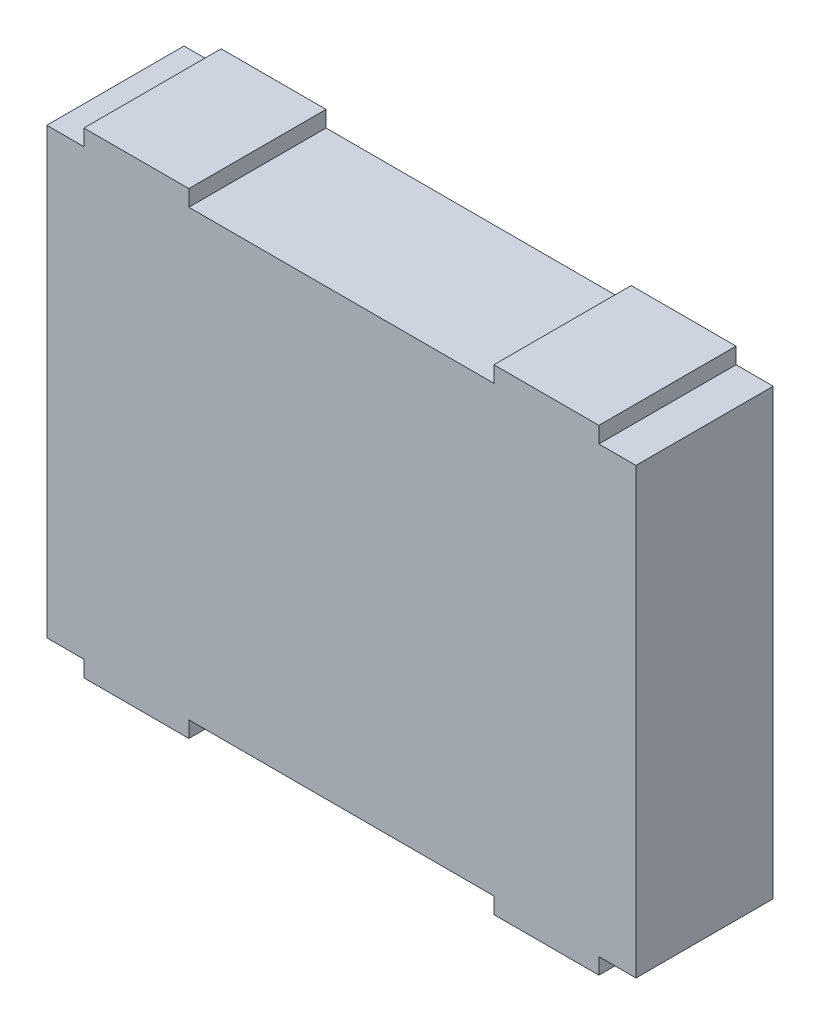
ISO-10303-21;
HEADER;
FILE_DESCRIPTION(('STEP AP214'),'2;1');
FILE_NAME('part.step','',(''),(''),'','','');
FILE_SCHEMA(('AUTOMOTIVE_DESIGN { 1 0 10303 214 1 1 1 1 }'));
ENDSEC;
DATA;
#1=APPLICATION_CONTEXT('core data for automotive mechanical design processes');
#2=APPLICATION_PROTOCOL_DEFINITION('international standard','automotive_design',2000,#1);
#3=PRODUCT_CONTEXT('',#1,'mechanical');
#4=PRODUCT('Part','Part','',(#3));
#5=PRODUCT_RELATED_PRODUCT_CATEGORY('part','',(#4));
#6=PRODUCT_DEFINITION_FORMATION('','',#4);
#7=PRODUCT_DEFINITION_CONTEXT('part definition',#1,'design');
#8=PRODUCT_DEFINITION('design','',#6,#7);
#9=PRODUCT_DEFINITION_SHAPE('','',#8);
#10=(LENGTH_UNIT() NAMED_UNIT(*) SI_UNIT(.MILLI.,.METRE.));
#11=(NAMED_UNIT(*) PLANE_ANGLE_UNIT() SI_UNIT($,.RADIAN.));
#12=(NAMED_UNIT(*) SI_UNIT($,.STERADIAN.) SOLID_ANGLE_UNIT());
#13=UNCERTAINTY_MEASURE_WITH_UNIT(LENGTH_MEASURE(1.E-05),#10,'distance_accuracy_value','');
#14=(GEOMETRIC_REPRESENTATION_CONTEXT(3) GLOBAL_UNCERTAINTY_ASSIGNED_CONTEXT((#13)) GLOBAL_UNIT_ASSIGNED_CONTEXT((#10,
#11,#12)) REPRESENTATION_CONTEXT('',''));
#15=CARTESIAN_POINT('',(0.,0.,0.));
#16=DIRECTION('',(0.,0.,1.));
#17=DIRECTION('',(1.,0.,0.));
#18=AXIS2_PLACEMENT_3D('',#15,#16,#17);
#19=CARTESIAN_POINT('',(1.89,2.95,1.7));
#20=DIRECTION('',(0.,-1.,0.));
#21=DIRECTION('',(0.,0.,-1.));
#22=AXIS2_PLACEMENT_3D('',#19,#20,#21);
#23=PLANE('',#22);
#24=DIRECTION('',(-1.,0.,0.));
#25=VECTOR('',#24,1.);
#26=CARTESIAN_POINT('',(1.89,2.95,0.));
#27=LINE('',#26,#25);
#28=CARTESIAN_POINT('',(3.19,2.95,0.));
#29=VERTEX_POINT('',#28);
#30=CARTESIAN_POINT('',(1.89,2.95,0.));
#31=VERTEX_POINT('',#30);
#32=EDGE_CURVE('E202',#29,#31,#27,.T.);
#33=ORIENTED_EDGE('',*,*,#32,.T.);
#34=DIRECTION('',(0.,0.,-1.));
#35=VECTOR('',#34,1.);
#36=CARTESIAN_POINT('',(1.89,2.95,1.7));
#37=LINE('',#36,#35);
#38=CARTESIAN_POINT('',(1.89,2.95,1.7));
#39=VERTEX_POINT('',#38);
#40=EDGE_CURVE('E11',#39,#31,#37,.T.);
#41=ORIENTED_EDGE('',*,*,#40,.F.);
#42=DIRECTION('',(-1.,0.,0.));
#43=VECTOR('',#42,1.);
#44=CARTESIAN_POINT('',(1.89,2.95,1.7));
#45=LINE('',#44,#43);
#46=CARTESIAN_POINT('',(3.19,2.95,1.7));
#47=VERTEX_POINT('',#46);
#48=EDGE_CURVE('E240',#47,#39,#45,.T.);
#49=ORIENTED_EDGE('',*,*,#48,.F.);
#50=DIRECTION('',(0.,0.,-1.));
#51=VECTOR('',#50,1.);
#52=CARTESIAN_POINT('',(3.19,2.95,1.7));
#53=LINE('',#52,#51);
#54=EDGE_CURVE('E198',#47,#29,#53,.T.);
#55=ORIENTED_EDGE('',*,*,#54,.T.);
#56=EDGE_LOOP('',(#33,#41,#49,#55));
#57=FACE_BOUND('',#56,.T.);
#58=ADVANCED_FACE('F34',(#57),#23,.F.);
#59=CARTESIAN_POINT('',(1.89,2.75,1.7));
#60=DIRECTION('',(1.,0.,0.));
#61=DIRECTION('',(0.,0.,-1.));
#62=AXIS2_PLACEMENT_3D('',#59,#60,#61);
#63=PLANE('',#62);
#64=DIRECTION('',(0.,-1.,0.));
#65=VECTOR('',#64,1.);
#66=CARTESIAN_POINT('',(1.89,2.75,0.));
#67=LINE('',#66,#65);
#68=CARTESIAN_POINT('',(1.89,2.75,0.));
#69=VERTEX_POINT('',#68);
#70=EDGE_CURVE('E205',#31,#69,#67,.T.);
#71=ORIENTED_EDGE('',*,*,#70,.T.);
#72=DIRECTION('',(0.,0.,-1.));
#73=VECTOR('',#72,1.);
#74=CARTESIAN_POINT('',(1.89,2.75,1.7));
#75=LINE('',#74,#73);
#76=CARTESIAN_POINT('',(1.89,2.75,1.7));
#77=VERTEX_POINT('',#76);
#78=EDGE_CURVE('E42',#77,#69,#75,.T.);
#79=ORIENTED_EDGE('',*,*,#78,.F.);
#80=DIRECTION('',(0.,-1.,0.));
#81=VECTOR('',#80,1.);
#82=CARTESIAN_POINT('',(1.89,2.75,1.7));
#83=LINE('',#82,#81);
#84=EDGE_CURVE('E129',#39,#77,#83,.T.);
#85=ORIENTED_EDGE('',*,*,#84,.F.);
#86=ORIENTED_EDGE('',*,*,#40,.T.);
#87=EDGE_LOOP('',(#71,#79,#85,#86));
#88=FACE_BOUND('',#87,.T.);
#89=ADVANCED_FACE('F358',(#88),#63,.F.);
#90=CARTESIAN_POINT('',(-1.89,2.75,1.7));
#91=DIRECTION('',(0.,-1.,0.));
#92=DIRECTION('',(0.,0.,-1.));
#93=AXIS2_PLACEMENT_3D('',#90,#91,#92);
#94=PLANE('',#93);
#95=DIRECTION('',(-1.,0.,0.));
#96=VECTOR('',#95,1.);
#97=CARTESIAN_POINT('',(-1.89,2.75,0.));
#98=LINE('',#97,#96);
#99=CARTESIAN_POINT('',(-1.89,2.75,0.));
#100=VERTEX_POINT('',#99);
#101=EDGE_CURVE('E207',#69,#100,#98,.T.);
#102=ORIENTED_EDGE('',*,*,#101,.T.);
#103=DIRECTION('',(0.,0.,-1.));
#104=VECTOR('',#103,1.);
#105=CARTESIAN_POINT('',(-1.89,2.75,1.7));
#106=LINE('',#105,#104);
#107=CARTESIAN_POINT('',(-1.89,2.75,1.7));
#108=VERTEX_POINT('',#107);
#109=EDGE_CURVE('E283',#108,#100,#106,.T.);
#110=ORIENTED_EDGE('',*,*,#109,.F.);
#111=DIRECTION('',(-1.,0.,0.));
#112=VECTOR('',#111,1.);
#113=CARTESIAN_POINT('',(-1.89,2.75,1.7));
#114=LINE('',#113,#112);
#115=EDGE_CURVE('E291',#77,#108,#114,.T.);
#116=ORIENTED_EDGE('',*,*,#115,.F.);
#117=ORIENTED_EDGE('',*,*,#78,.T.);
#118=EDGE_LOOP('',(#102,#110,#116,#117));
#119=FACE_BOUND('',#118,.T.);
#120=ADVANCED_FACE('F289',(#119),#94,.F.);
#121=CARTESIAN_POINT('',(-1.89,2.95,1.7));
#122=DIRECTION('',(-1.,0.,0.));
#123=DIRECTION('',(0.,0.,1.));
#124=AXIS2_PLACEMENT_3D('',#121,#122,#123);
#125=PLANE('',#124);
#126=DIRECTION('',(0.,1.,0.));
#127=VECTOR('',#126,1.);
#128=CARTESIAN_POINT('',(-1.89,2.95,0.));
#129=LINE('',#128,#127);
#130=CARTESIAN_POINT('',(-1.89,2.95,0.));
#131=VERTEX_POINT('',#130);
#132=EDGE_CURVE('E209',#100,#131,#129,.T.);
#133=ORIENTED_EDGE('',*,*,#132,.T.);
#134=DIRECTION('',(0.,0.,-1.));
#135=VECTOR('',#134,1.);
#136=CARTESIAN_POINT('',(-1.89,2.95,1.7));
#137=LINE('',#136,#135);
#138=CARTESIAN_POINT('',(-1.89,2.95,1.7));
#139=VERTEX_POINT('',#138);
#140=EDGE_CURVE('E280',#139,#131,#137,.T.);
#141=ORIENTED_EDGE('',*,*,#140,.F.);
#142=DIRECTION('',(0.,1.,0.));
#143=VECTOR('',#142,1.);
#144=CARTESIAN_POINT('',(-1.89,2.95,1.7));
#145=LINE('',#144,#143);
#146=EDGE_CURVE('E309',#108,#139,#145,.T.);
#147=ORIENTED_EDGE('',*,*,#146,.F.);
#148=ORIENTED_EDGE('',*,*,#109,.T.);
#149=EDGE_LOOP('',(#133,#141,#147,#148));
#150=FACE_BOUND('',#149,.T.);
#151=ADVANCED_FACE('F300',(#150),#125,.F.);
#152=CARTESIAN_POINT('',(-3.19,2.95,1.7));
#153=DIRECTION('',(0.,-1.,0.));
#154=DIRECTION('',(0.,0.,-1.));
#155=AXIS2_PLACEMENT_3D('',#152,#153,#154);
#156=PLANE('',#155);
#157=DIRECTION('',(-1.,0.,0.));
#158=VECTOR('',#157,1.);
#159=CARTESIAN_POINT('',(-3.19,2.95,0.));
#160=LINE('',#159,#158);
#161=CARTESIAN_POINT('',(-3.19,2.95,0.));
#162=VERTEX_POINT('',#161);
#163=EDGE_CURVE('E211',#131,#162,#160,.T.);
#164=ORIENTED_EDGE('',*,*,#163,.T.);
#165=DIRECTION('',(0.,0.,-1.));
#166=VECTOR('',#165,1.);
#167=CARTESIAN_POINT('',(-3.19,2.95,1.7));
#168=LINE('',#167,#166);
#169=CARTESIAN_POINT('',(-3.19,2.95,1.7));
#170=VERTEX_POINT('',#169);
#171=EDGE_CURVE('E277',#170,#162,#168,.T.);
#172=ORIENTED_EDGE('',*,*,#171,.F.);
#173=DIRECTION('',(-1.,0.,0.));
#174=VECTOR('',#173,1.);
#175=CARTESIAN_POINT('',(-3.19,2.95,1.7));
#176=LINE('',#175,#174);
#177=EDGE_CURVE('E306',#139,#170,#176,.T.);
#178=ORIENTED_EDGE('',*,*,#177,.F.);
#179=ORIENTED_EDGE('',*,*,#140,.T.);
#180=EDGE_LOOP('',(#164,#172,#178,#179));
#181=FACE_BOUND('',#180,.T.);
#182=ADVANCED_FACE('F304',(#181),#156,.F.);
#183=CARTESIAN_POINT('',(-3.19,2.75,1.7));
#184=DIRECTION('',(1.,0.,0.));
#185=DIRECTION('',(0.,0.,-1.));
#186=AXIS2_PLACEMENT_3D('',#183,#184,#185);
#187=PLANE('',#186);
#188=DIRECTION('',(0.,-1.,0.));
#189=VECTOR('',#188,1.);
#190=CARTESIAN_POINT('',(-3.19,2.75,0.));
#191=LINE('',#190,#189);
#192=CARTESIAN_POINT('',(-3.19,2.75,0.));
#193=VERTEX_POINT('',#192);
#194=EDGE_CURVE('E213',#162,#193,#191,.T.);
#195=ORIENTED_EDGE('',*,*,#194,.T.);
#196=DIRECTION('',(0.,0.,-1.));
#197=VECTOR('',#196,1.);
#198=CARTESIAN_POINT('',(-3.19,2.75,1.7));
#199=LINE('',#198,#197);
#200=CARTESIAN_POINT('',(-3.19,2.75,1.7));
#201=VERTEX_POINT('',#200);
#202=EDGE_CURVE('E274',#201,#193,#199,.T.);
#203=ORIENTED_EDGE('',*,*,#202,.F.);
#204=DIRECTION('',(0.,-1.,0.));
#205=VECTOR('',#204,1.);
#206=CARTESIAN_POINT('',(-3.19,2.75,1.7));
#207=LINE('',#206,#205);
#208=EDGE_CURVE('E308',#170,#201,#207,.T.);
#209=ORIENTED_EDGE('',*,*,#208,.F.);
#210=ORIENTED_EDGE('',*,*,#171,.T.);
#211=EDGE_LOOP('',(#195,#203,#209,#210));
#212=FACE_BOUND('',#211,.T.);
#213=ADVANCED_FACE('F371',(#212),#187,.F.);
#214=CARTESIAN_POINT('',(-3.65,2.75,1.7));
#215=DIRECTION('',(0.,-1.,0.));
#216=DIRECTION('',(0.,0.,-1.));
#217=AXIS2_PLACEMENT_3D('',#214,#215,#216);
#218=PLANE('',#217);
#219=DIRECTION('',(-1.,0.,0.));
#220=VECTOR('',#219,1.);
#221=CARTESIAN_POINT('',(-3.65,2.75,0.));
#222=LINE('',#221,#220);
#223=CARTESIAN_POINT('',(-3.65,2.75,0.));
#224=VERTEX_POINT('',#223);
#225=EDGE_CURVE('E215',#193,#224,#222,.T.);
#226=ORIENTED_EDGE('',*,*,#225,.T.);
#227=DIRECTION('',(0.,0.,-1.));
#228=VECTOR('',#227,1.);
#229=CARTESIAN_POINT('',(-3.65,2.75,1.7));
#230=LINE('',#229,#228);
#231=CARTESIAN_POINT('',(-3.65,2.75,1.7));
#232=VERTEX_POINT('',#231);
#233=EDGE_CURVE('E271',#232,#224,#230,.T.);
#234=ORIENTED_EDGE('',*,*,#233,.F.);
#235=DIRECTION('',(-1.,0.,0.));
#236=VECTOR('',#235,1.);
#237=CARTESIAN_POINT('',(-3.65,2.75,1.7));
#238=LINE('',#237,#236);
#239=EDGE_CURVE('E311',#201,#232,#238,.T.);
#240=ORIENTED_EDGE('',*,*,#239,.F.);
#241=ORIENTED_EDGE('',*,*,#202,.T.);
#242=EDGE_LOOP('',(#226,#234,#240,#241));
#243=FACE_BOUND('',#242,.T.);
#244=ADVANCED_FACE('F374',(#243),#218,.F.);
#245=CARTESIAN_POINT('',(-3.65,-2.75,1.7));
#246=DIRECTION('',(1.,0.,0.));
#247=DIRECTION('',(0.,0.,-1.));
#248=AXIS2_PLACEMENT_3D('',#245,#246,#247);
#249=PLANE('',#248);
#250=DIRECTION('',(0.,-1.,0.));
#251=VECTOR('',#250,1.);
#252=CARTESIAN_POINT('',(-3.65,-2.75,0.));
#253=LINE('',#252,#251);
#254=CARTESIAN_POINT('',(-3.65,-2.75,0.));
#255=VERTEX_POINT('',#254);
#256=EDGE_CURVE('E217',#224,#255,#253,.T.);
#257=ORIENTED_EDGE('',*,*,#256,.T.);
#258=DIRECTION('',(0.,0.,-1.));
#259=VECTOR('',#258,1.);
#260=CARTESIAN_POINT('',(-3.65,-2.75,1.7));
#261=LINE('',#260,#259);
#262=CARTESIAN_POINT('',(-3.65,-2.75,1.7));
#263=VERTEX_POINT('',#262);
#264=EDGE_CURVE('E268',#263,#255,#261,.T.);
#265=ORIENTED_EDGE('',*,*,#264,.F.);
#266=DIRECTION('',(0.,-1.,0.));
#267=VECTOR('',#266,1.);
#268=CARTESIAN_POINT('',(-3.65,-2.75,1.7));
#269=LINE('',#268,#267);
#270=EDGE_CURVE('E317',#232,#263,#269,.T.);
#271=ORIENTED_EDGE('',*,*,#270,.F.);
#272=ORIENTED_EDGE('',*,*,#233,.T.);
#273=EDGE_LOOP('',(#257,#265,#271,#272));
#274=FACE_BOUND('',#273,.T.);
#275=ADVANCED_FACE('F378',(#274),#249,.F.);
#276=CARTESIAN_POINT('',(-3.19,-2.75,1.7));
#277=DIRECTION('',(0.,1.,0.));
#278=DIRECTION('',(0.,0.,1.));
#279=AXIS2_PLACEMENT_3D('',#276,#277,#278);
#280=PLANE('',#279);
#281=DIRECTION('',(1.,0.,0.));
#282=VECTOR('',#281,1.);
#283=CARTESIAN_POINT('',(-3.19,-2.75,0.));
#284=LINE('',#283,#282);
#285=CARTESIAN_POINT('',(-3.19,-2.75,0.));
#286=VERTEX_POINT('',#285);
#287=EDGE_CURVE('E219',#255,#286,#284,.T.);
#288=ORIENTED_EDGE('',*,*,#287,.T.);
#289=DIRECTION('',(0.,0.,-1.));
#290=VECTOR('',#289,1.);
#291=CARTESIAN_POINT('',(-3.19,-2.75,1.7));
#292=LINE('',#291,#290);
#293=CARTESIAN_POINT('',(-3.19,-2.75,1.7));
#294=VERTEX_POINT('',#293);
#295=EDGE_CURVE('E265',#294,#286,#292,.T.);
#296=ORIENTED_EDGE('',*,*,#295,.F.);
#297=DIRECTION('',(1.,0.,0.));
#298=VECTOR('',#297,1.);
#299=CARTESIAN_POINT('',(-3.19,-2.75,1.7));
#300=LINE('',#299,#298);
#301=EDGE_CURVE('E319',#263,#294,#300,.T.);
#302=ORIENTED_EDGE('',*,*,#301,.F.);
#303=ORIENTED_EDGE('',*,*,#264,.T.);
#304=EDGE_LOOP('',(#288,#296,#302,#303));
#305=FACE_BOUND('',#304,.T.);
#306=ADVANCED_FACE('F382',(#305),#280,.F.);
#307=CARTESIAN_POINT('',(-3.19,-2.95,1.7));
#308=DIRECTION('',(1.,0.,0.));
#309=DIRECTION('',(0.,0.,-1.));
#310=AXIS2_PLACEMENT_3D('',#307,#308,#309);
#311=PLANE('',#310);
#312=DIRECTION('',(0.,-1.,0.));
#313=VECTOR('',#312,1.);
#314=CARTESIAN_POINT('',(-3.19,-2.95,0.));
#315=LINE('',#314,#313);
#316=CARTESIAN_POINT('',(-3.19,-2.95,0.));
#317=VERTEX_POINT('',#316);
#318=EDGE_CURVE('E221',#286,#317,#315,.T.);
#319=ORIENTED_EDGE('',*,*,#318,.T.);
#320=DIRECTION('',(0.,0.,-1.));
#321=VECTOR('',#320,1.);
#322=CARTESIAN_POINT('',(-3.19,-2.95,1.7));
#323=LINE('',#322,#321);
#324=CARTESIAN_POINT('',(-3.19,-2.95,1.7));
#325=VERTEX_POINT('',#324);
#326=EDGE_CURVE('E262',#325,#317,#323,.T.);
#327=ORIENTED_EDGE('',*,*,#326,.F.);
#328=DIRECTION('',(0.,-1.,0.));
#329=VECTOR('',#328,1.);
#330=CARTESIAN_POINT('',(-3.19,-2.95,1.7));
#331=LINE('',#330,#329);
#332=EDGE_CURVE('E321',#294,#325,#331,.T.);
#333=ORIENTED_EDGE('',*,*,#332,.F.);
#334=ORIENTED_EDGE('',*,*,#295,.T.);
#335=EDGE_LOOP('',(#319,#327,#333,#334));
#336=FACE_BOUND('',#335,.T.);
#337=ADVANCED_FACE('F386',(#336),#311,.F.);
#338=CARTESIAN_POINT('',(-1.89,-2.95,1.7));
#339=DIRECTION('',(0.,1.,0.));
#340=DIRECTION('',(0.,0.,1.));
#341=AXIS2_PLACEMENT_3D('',#338,#339,#340);
#342=PLANE('',#341);
#343=DIRECTION('',(1.,0.,0.));
#344=VECTOR('',#343,1.);
#345=CARTESIAN_POINT('',(-1.89,-2.95,0.));
#346=LINE('',#345,#344);
#347=CARTESIAN_POINT('',(-1.89,-2.95,0.));
#348=VERTEX_POINT('',#347);
#349=EDGE_CURVE('E223',#317,#348,#346,.T.);
#350=ORIENTED_EDGE('',*,*,#349,.T.);
#351=DIRECTION('',(0.,0.,-1.));
#352=VECTOR('',#351,1.);
#353=CARTESIAN_POINT('',(-1.89,-2.95,1.7));
#354=LINE('',#353,#352);
#355=CARTESIAN_POINT('',(-1.89,-2.95,1.7));
#356=VERTEX_POINT('',#355);
#357=EDGE_CURVE('E259',#356,#348,#354,.T.);
#358=ORIENTED_EDGE('',*,*,#357,.F.);
#359=DIRECTION('',(1.,0.,0.));
#360=VECTOR('',#359,1.);
#361=CARTESIAN_POINT('',(-1.89,-2.95,1.7));
#362=LINE('',#361,#360);
#363=EDGE_CURVE('E323',#325,#356,#362,.T.);
#364=ORIENTED_EDGE('',*,*,#363,.F.);
#365=ORIENTED_EDGE('',*,*,#326,.T.);
#366=EDGE_LOOP('',(#350,#358,#364,#365));
#367=FACE_BOUND('',#366,.T.);
#368=ADVANCED_FACE('F390',(#367),#342,.F.);
#369=CARTESIAN_POINT('',(-1.89,-2.75,1.7));
#370=DIRECTION('',(-1.,0.,0.));
#371=DIRECTION('',(0.,0.,1.));
#372=AXIS2_PLACEMENT_3D('',#369,#370,#371);
#373=PLANE('',#372);
#374=DIRECTION('',(0.,1.,0.));
#375=VECTOR('',#374,1.);
#376=CARTESIAN_POINT('',(-1.89,-2.75,0.));
#377=LINE('',#376,#375);
#378=CARTESIAN_POINT('',(-1.89,-2.75,0.));
#379=VERTEX_POINT('',#378);
#380=EDGE_CURVE('E225',#348,#379,#377,.T.);
#381=ORIENTED_EDGE('',*,*,#380,.T.);
#382=DIRECTION('',(0.,0.,-1.));
#383=VECTOR('',#382,1.);
#384=CARTESIAN_POINT('',(-1.89,-2.75,1.7));
#385=LINE('',#384,#383);
#386=CARTESIAN_POINT('',(-1.89,-2.75,1.7));
#387=VERTEX_POINT('',#386);
#388=EDGE_CURVE('E256',#387,#379,#385,.T.);
#389=ORIENTED_EDGE('',*,*,#388,.F.);
#390=DIRECTION('',(0.,1.,0.));
#391=VECTOR('',#390,1.);
#392=CARTESIAN_POINT('',(-1.89,-2.75,1.7));
#393=LINE('',#392,#391);
#394=EDGE_CURVE('E325',#356,#387,#393,.T.);
#395=ORIENTED_EDGE('',*,*,#394,.F.);
#396=ORIENTED_EDGE('',*,*,#357,.T.);
#397=EDGE_LOOP('',(#381,#389,#395,#396));
#398=FACE_BOUND('',#397,.T.);
#399=ADVANCED_FACE('F394',(#398),#373,.F.);
#400=CARTESIAN_POINT('',(1.89,-2.75,1.7));
#401=DIRECTION('',(0.,1.,0.));
#402=DIRECTION('',(0.,0.,1.));
#403=AXIS2_PLACEMENT_3D('',#400,#401,#402);
#404=PLANE('',#403);
#405=DIRECTION('',(1.,0.,0.));
#406=VECTOR('',#405,1.);
#407=CARTESIAN_POINT('',(1.89,-2.75,0.));
#408=LINE('',#407,#406);
#409=CARTESIAN_POINT('',(1.89,-2.75,0.));
#410=VERTEX_POINT('',#409);
#411=EDGE_CURVE('E227',#379,#410,#408,.T.);
#412=ORIENTED_EDGE('',*,*,#411,.T.);
#413=DIRECTION('',(0.,0.,-1.));
#414=VECTOR('',#413,1.);
#415=CARTESIAN_POINT('',(1.89,-2.75,1.7));
#416=LINE('',#415,#414);
#417=CARTESIAN_POINT('',(1.89,-2.75,1.7));
#418=VERTEX_POINT('',#417);
#419=EDGE_CURVE('E253',#418,#410,#416,.T.);
#420=ORIENTED_EDGE('',*,*,#419,.F.);
#421=DIRECTION('',(1.,0.,0.));
#422=VECTOR('',#421,1.);
#423=CARTESIAN_POINT('',(1.89,-2.75,1.7));
#424=LINE('',#423,#422);
#425=EDGE_CURVE('E327',#387,#418,#424,.T.);
#426=ORIENTED_EDGE('',*,*,#425,.F.);
#427=ORIENTED_EDGE('',*,*,#388,.T.);
#428=EDGE_LOOP('',(#412,#420,#426,#427));
#429=FACE_BOUND('',#428,.T.);
#430=ADVANCED_FACE('F398',(#429),#404,.F.);
#431=CARTESIAN_POINT('',(1.89,-2.95,1.7));
#432=DIRECTION('',(1.,0.,0.));
#433=DIRECTION('',(0.,0.,-1.));
#434=AXIS2_PLACEMENT_3D('',#431,#432,#433);
#435=PLANE('',#434);
#436=DIRECTION('',(0.,-1.,0.));
#437=VECTOR('',#436,1.);
#438=CARTESIAN_POINT('',(1.89,-2.95,0.));
#439=LINE('',#438,#437);
#440=CARTESIAN_POINT('',(1.89,-2.95,0.));
#441=VERTEX_POINT('',#440);
#442=EDGE_CURVE('E229',#410,#441,#439,.T.);
#443=ORIENTED_EDGE('',*,*,#442,.T.);
#444=DIRECTION('',(0.,0.,-1.));
#445=VECTOR('',#444,1.);
#446=CARTESIAN_POINT('',(1.89,-2.95,1.7));
#447=LINE('',#446,#445);
#448=CARTESIAN_POINT('',(1.89,-2.95,1.7));
#449=VERTEX_POINT('',#448);
#450=EDGE_CURVE('E250',#449,#441,#447,.T.);
#451=ORIENTED_EDGE('',*,*,#450,.F.);
#452=DIRECTION('',(0.,-1.,0.));
#453=VECTOR('',#452,1.);
#454=CARTESIAN_POINT('',(1.89,-2.95,1.7));
#455=LINE('',#454,#453);
#456=EDGE_CURVE('E329',#418,#449,#455,.T.);
#457=ORIENTED_EDGE('',*,*,#456,.F.);
#458=ORIENTED_EDGE('',*,*,#419,.T.);
#459=EDGE_LOOP('',(#443,#451,#457,#458));
#460=FACE_BOUND('',#459,.T.);
#461=ADVANCED_FACE('F402',(#460),#435,.F.);
#462=CARTESIAN_POINT('',(3.19,-2.95,1.7));
#463=DIRECTION('',(0.,1.,0.));
#464=DIRECTION('',(0.,0.,1.));
#465=AXIS2_PLACEMENT_3D('',#462,#463,#464);
#466=PLANE('',#465);
#467=DIRECTION('',(1.,0.,0.));
#468=VECTOR('',#467,1.);
#469=CARTESIAN_POINT('',(3.19,-2.95,0.));
#470=LINE('',#469,#468);
#471=CARTESIAN_POINT('',(3.19,-2.95,0.));
#472=VERTEX_POINT('',#471);
#473=EDGE_CURVE('E231',#441,#472,#470,.T.);
#474=ORIENTED_EDGE('',*,*,#473,.T.);
#475=DIRECTION('',(0.,0.,-1.));
#476=VECTOR('',#475,1.);
#477=CARTESIAN_POINT('',(3.19,-2.95,1.7));
#478=LINE('',#477,#476);
#479=CARTESIAN_POINT('',(3.19,-2.95,1.7));
#480=VERTEX_POINT('',#479);
#481=EDGE_CURVE('E247',#480,#472,#478,.T.);
#482=ORIENTED_EDGE('',*,*,#481,.F.);
#483=DIRECTION('',(1.,0.,0.));
#484=VECTOR('',#483,1.);
#485=CARTESIAN_POINT('',(3.19,-2.95,1.7));
#486=LINE('',#485,#484);
#487=EDGE_CURVE('E331',#449,#480,#486,.T.);
#488=ORIENTED_EDGE('',*,*,#487,.F.);
#489=ORIENTED_EDGE('',*,*,#450,.T.);
#490=EDGE_LOOP('',(#474,#482,#488,#489));
#491=FACE_BOUND('',#490,.T.);
#492=ADVANCED_FACE('F406',(#491),#466,.F.);
#493=CARTESIAN_POINT('',(3.19,-2.75,1.7));
#494=DIRECTION('',(-1.,0.,0.));
#495=DIRECTION('',(0.,0.,1.));
#496=AXIS2_PLACEMENT_3D('',#493,#494,#495);
#497=PLANE('',#496);
#498=DIRECTION('',(0.,1.,0.));
#499=VECTOR('',#498,1.);
#500=CARTESIAN_POINT('',(3.19,-2.75,0.));
#501=LINE('',#500,#499);
#502=CARTESIAN_POINT('',(3.19,-2.75,0.));
#503=VERTEX_POINT('',#502);
#504=EDGE_CURVE('E233',#472,#503,#501,.T.);
#505=ORIENTED_EDGE('',*,*,#504,.T.);
#506=DIRECTION('',(0.,0.,-1.));
#507=VECTOR('',#506,1.);
#508=CARTESIAN_POINT('',(3.19,-2.75,1.7));
#509=LINE('',#508,#507);
#510=CARTESIAN_POINT('',(3.19,-2.75,1.7));
#511=VERTEX_POINT('',#510);
#512=EDGE_CURVE('E244',#511,#503,#509,.T.);
#513=ORIENTED_EDGE('',*,*,#512,.F.);
#514=DIRECTION('',(0.,1.,0.));
#515=VECTOR('',#514,1.);
#516=CARTESIAN_POINT('',(3.19,-2.75,1.7));
#517=LINE('',#516,#515);
#518=EDGE_CURVE('E333',#480,#511,#517,.T.);
#519=ORIENTED_EDGE('',*,*,#518,.F.);
#520=ORIENTED_EDGE('',*,*,#481,.T.);
#521=EDGE_LOOP('',(#505,#513,#519,#520));
#522=FACE_BOUND('',#521,.T.);
#523=ADVANCED_FACE('F339',(#522),#497,.F.);
#524=CARTESIAN_POINT('',(3.65,-2.75,1.7));
#525=DIRECTION('',(0.,1.,0.));
#526=DIRECTION('',(0.,0.,1.));
#527=AXIS2_PLACEMENT_3D('',#524,#525,#526);
#528=PLANE('',#527);
#529=DIRECTION('',(1.,0.,0.));
#530=VECTOR('',#529,1.);
#531=CARTESIAN_POINT('',(3.65,-2.75,0.));
#532=LINE('',#531,#530);
#533=CARTESIAN_POINT('',(3.65,-2.75,0.));
#534=VERTEX_POINT('',#533);
#535=EDGE_CURVE('E235',#503,#534,#532,.T.);
#536=ORIENTED_EDGE('',*,*,#535,.T.);
#537=DIRECTION('',(0.,0.,-1.));
#538=VECTOR('',#537,1.);
#539=CARTESIAN_POINT('',(3.65,-2.75,1.7));
#540=LINE('',#539,#538);
#541=CARTESIAN_POINT('',(3.65,-2.75,1.7));
#542=VERTEX_POINT('',#541);
#543=EDGE_CURVE('E193',#542,#534,#540,.T.);
#544=ORIENTED_EDGE('',*,*,#543,.F.);
#545=DIRECTION('',(1.,0.,0.));
#546=VECTOR('',#545,1.);
#547=CARTESIAN_POINT('',(3.65,-2.75,1.7));
#548=LINE('',#547,#546);
#549=EDGE_CURVE('E184',#511,#542,#548,.T.);
#550=ORIENTED_EDGE('',*,*,#549,.F.);
#551=ORIENTED_EDGE('',*,*,#512,.T.);
#552=EDGE_LOOP('',(#536,#544,#550,#551));
#553=FACE_BOUND('',#552,.T.);
#554=ADVANCED_FACE('F343',(#553),#528,.F.);
#555=CARTESIAN_POINT('',(3.65,2.75,1.7));
#556=DIRECTION('',(-1.,0.,0.));
#557=DIRECTION('',(0.,0.,1.));
#558=AXIS2_PLACEMENT_3D('',#555,#556,#557);
#559=PLANE('',#558);
#560=DIRECTION('',(0.,1.,0.));
#561=VECTOR('',#560,1.);
#562=CARTESIAN_POINT('',(3.65,2.75,0.));
#563=LINE('',#562,#561);
#564=CARTESIAN_POINT('',(3.65,2.75,0.));
#565=VERTEX_POINT('',#564);
#566=EDGE_CURVE('E192',#534,#565,#563,.T.);
#567=ORIENTED_EDGE('',*,*,#566,.T.);
#568=DIRECTION('',(0.,0.,-1.));
#569=VECTOR('',#568,1.);
#570=CARTESIAN_POINT('',(3.65,2.75,1.7));
#571=LINE('',#570,#569);
#572=CARTESIAN_POINT('',(3.65,2.75,1.7));
#573=VERTEX_POINT('',#572);
#574=EDGE_CURVE('E189',#573,#565,#571,.T.);
#575=ORIENTED_EDGE('',*,*,#574,.F.);
#576=DIRECTION('',(0.,1.,0.));
#577=VECTOR('',#576,1.);
#578=CARTESIAN_POINT('',(3.65,2.75,1.7));
#579=LINE('',#578,#577);
#580=EDGE_CURVE('E178',#542,#573,#579,.T.);
#581=ORIENTED_EDGE('',*,*,#580,.F.);
#582=ORIENTED_EDGE('',*,*,#543,.T.);
#583=EDGE_LOOP('',(#567,#575,#581,#582));
#584=FACE_BOUND('',#583,.T.);
#585=ADVANCED_FACE('F190',(#584),#559,.F.);
#586=CARTESIAN_POINT('',(3.19,2.75,1.7));
#587=DIRECTION('',(0.,-1.,0.));
#588=DIRECTION('',(0.,0.,-1.));
#589=AXIS2_PLACEMENT_3D('',#586,#587,#588);
#590=PLANE('',#589);
#591=DIRECTION('',(-1.,0.,0.));
#592=VECTOR('',#591,1.);
#593=CARTESIAN_POINT('',(3.19,2.75,0.));
#594=LINE('',#593,#592);
#595=CARTESIAN_POINT('',(3.19,2.75,0.));
#596=VERTEX_POINT('',#595);
#597=EDGE_CURVE('E115',#565,#596,#594,.T.);
#598=ORIENTED_EDGE('',*,*,#597,.T.);
#599=DIRECTION('',(0.,0.,-1.));
#600=VECTOR('',#599,1.);
#601=CARTESIAN_POINT('',(3.19,2.75,1.7));
#602=LINE('',#601,#600);
#603=CARTESIAN_POINT('',(3.19,2.75,1.7));
#604=VERTEX_POINT('',#603);
#605=EDGE_CURVE('E194',#604,#596,#602,.T.);
#606=ORIENTED_EDGE('',*,*,#605,.F.);
#607=DIRECTION('',(-1.,0.,0.));
#608=VECTOR('',#607,1.);
#609=CARTESIAN_POINT('',(3.19,2.75,1.7));
#610=LINE('',#609,#608);
#611=EDGE_CURVE('E182',#573,#604,#610,.T.);
#612=ORIENTED_EDGE('',*,*,#611,.F.);
#613=ORIENTED_EDGE('',*,*,#574,.T.);
#614=EDGE_LOOP('',(#598,#606,#612,#613));
#615=FACE_BOUND('',#614,.T.);
#616=ADVANCED_FACE('F196',(#615),#590,.F.);
#617=CARTESIAN_POINT('',(3.19,2.95,1.7));
#618=DIRECTION('',(-1.,0.,0.));
#619=DIRECTION('',(0.,0.,1.));
#620=AXIS2_PLACEMENT_3D('',#617,#618,#619);
#621=PLANE('',#620);
#622=DIRECTION('',(0.,1.,0.));
#623=VECTOR('',#622,1.);
#624=CARTESIAN_POINT('',(3.19,2.95,0.));
#625=LINE('',#624,#623);
#626=EDGE_CURVE('E121',#596,#29,#625,.T.);
#627=ORIENTED_EDGE('',*,*,#626,.T.);
#628=ORIENTED_EDGE('',*,*,#54,.F.);
#629=DIRECTION('',(0.,1.,0.));
#630=VECTOR('',#629,1.);
#631=CARTESIAN_POINT('',(3.19,2.95,1.7));
#632=LINE('',#631,#630);
#633=EDGE_CURVE('E50',#604,#47,#632,.T.);
#634=ORIENTED_EDGE('',*,*,#633,.F.);
#635=ORIENTED_EDGE('',*,*,#605,.T.);
#636=EDGE_LOOP('',(#627,#628,#634,#635));
#637=FACE_BOUND('',#636,.T.);
#638=ADVANCED_FACE('F347',(#637),#621,.F.);
#639=CARTESIAN_POINT('',(0.,0.,1.7));
#640=DIRECTION('',(0.,0.,-1.));
#641=DIRECTION('',(-1.,0.,0.));
#642=AXIS2_PLACEMENT_3D('',#639,#640,#641);
#643=PLANE('',#642);
#644=ORIENTED_EDGE('',*,*,#48,.T.);
#645=ORIENTED_EDGE('',*,*,#84,.T.);
#646=ORIENTED_EDGE('',*,*,#115,.T.);
#647=ORIENTED_EDGE('',*,*,#146,.T.);
#648=ORIENTED_EDGE('',*,*,#177,.T.);
#649=ORIENTED_EDGE('',*,*,#208,.T.);
#650=ORIENTED_EDGE('',*,*,#239,.T.);
#651=ORIENTED_EDGE('',*,*,#270,.T.);
#652=ORIENTED_EDGE('',*,*,#301,.T.);
#653=ORIENTED_EDGE('',*,*,#332,.T.);
#654=ORIENTED_EDGE('',*,*,#363,.T.);
#655=ORIENTED_EDGE('',*,*,#394,.T.);
#656=ORIENTED_EDGE('',*,*,#425,.T.);
#657=ORIENTED_EDGE('',*,*,#456,.T.);
#658=ORIENTED_EDGE('',*,*,#487,.T.);
#659=ORIENTED_EDGE('',*,*,#518,.T.);
#660=ORIENTED_EDGE('',*,*,#549,.T.);
#661=ORIENTED_EDGE('',*,*,#580,.T.);
#662=ORIENTED_EDGE('',*,*,#611,.T.);
#663=ORIENTED_EDGE('',*,*,#633,.T.);
#664=EDGE_LOOP('',(#644,#645,#646,#647,#648,#649,#650,#651,#652,#653,#654,#655,#656,#657,#658,
#659,#660,#661,#662,#663));
#665=FACE_BOUND('',#664,.T.);
#666=ADVANCED_FACE('F180',(#665),#643,.F.);
#667=CARTESIAN_POINT('',(0.,0.,0.));
#668=DIRECTION('',(0.,0.,-1.));
#669=DIRECTION('',(-1.,0.,0.));
#670=AXIS2_PLACEMENT_3D('',#667,#668,#669);
#671=PLANE('',#670);
#672=ORIENTED_EDGE('',*,*,#32,.F.);
#673=ORIENTED_EDGE('',*,*,#626,.F.);
#674=ORIENTED_EDGE('',*,*,#597,.F.);
#675=ORIENTED_EDGE('',*,*,#566,.F.);
#676=ORIENTED_EDGE('',*,*,#535,.F.);
#677=ORIENTED_EDGE('',*,*,#504,.F.);
#678=ORIENTED_EDGE('',*,*,#473,.F.);
#679=ORIENTED_EDGE('',*,*,#442,.F.);
#680=ORIENTED_EDGE('',*,*,#411,.F.);
#681=ORIENTED_EDGE('',*,*,#380,.F.);
#682=ORIENTED_EDGE('',*,*,#349,.F.);
#683=ORIENTED_EDGE('',*,*,#318,.F.);
#684=ORIENTED_EDGE('',*,*,#287,.F.);
#685=ORIENTED_EDGE('',*,*,#256,.F.);
#686=ORIENTED_EDGE('',*,*,#225,.F.);
#687=ORIENTED_EDGE('',*,*,#194,.F.);
#688=ORIENTED_EDGE('',*,*,#163,.F.);
#689=ORIENTED_EDGE('',*,*,#132,.F.);
#690=ORIENTED_EDGE('',*,*,#101,.F.);
#691=ORIENTED_EDGE('',*,*,#70,.F.);
#692=EDGE_LOOP('',(#672,#673,#674,#675,#676,#677,#678,#679,#680,#681,#682,#683,#684,#685,#686,
#687,#688,#689,#690,#691));
#693=FACE_BOUND('',#692,.T.);
#694=ADVANCED_FACE('F295',(#693),#671,.T.);
#695=CLOSED_SHELL('',(#58,#89,#120,#151,#182,#213,#244,#275,#306,#337,#368,#399,#430,#461,#492,
#523,#554,#585,#616,#638,#666,#694));
#696=MANIFOLD_SOLID_BREP('B2',#695);
#697=ADVANCED_BREP_SHAPE_REPRESENTATION('',(#18,#696),#14);
#698=SHAPE_DEFINITION_REPRESENTATION(#9,#697);
ENDSEC;
END-ISO-10303-21;
